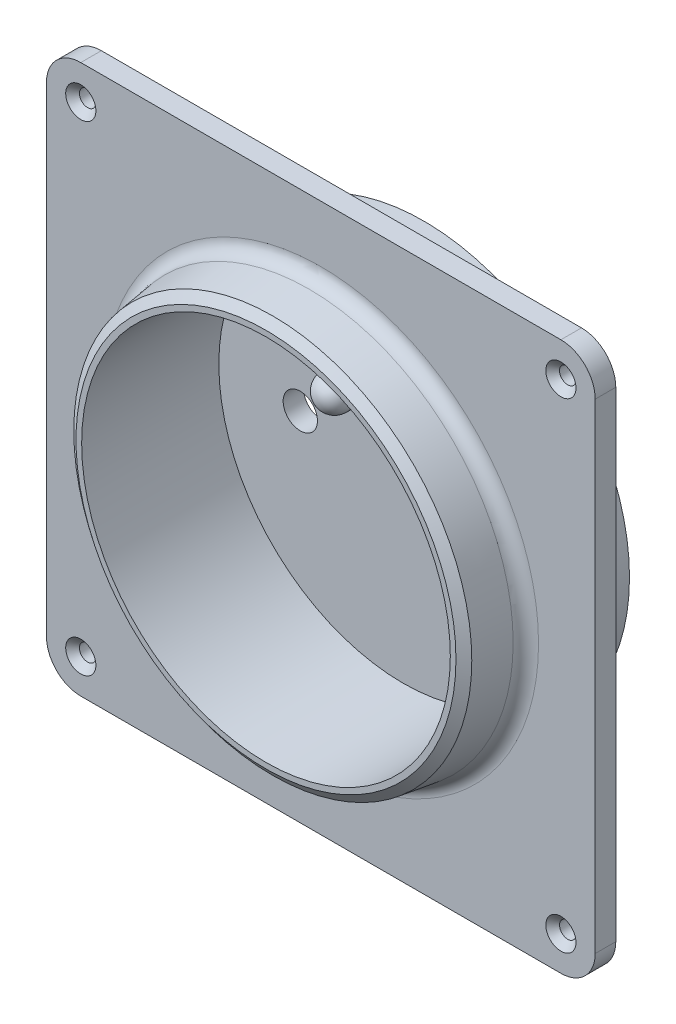
ISO-10303-21;
HEADER;
FILE_DESCRIPTION(('STEP AP214'),'2;1');
FILE_NAME('part.step','',(''),(''),'','','');
FILE_SCHEMA(('AUTOMOTIVE_DESIGN { 1 0 10303 214 1 1 1 1 }'));
ENDSEC;
DATA;
#1=APPLICATION_CONTEXT('core data for automotive mechanical design processes');
#2=APPLICATION_PROTOCOL_DEFINITION('international standard','automotive_design',2000,#1);
#3=PRODUCT_CONTEXT('',#1,'mechanical');
#4=PRODUCT('Part','Part','',(#3));
#5=PRODUCT_RELATED_PRODUCT_CATEGORY('part','',(#4));
#6=PRODUCT_DEFINITION_FORMATION('','',#4);
#7=PRODUCT_DEFINITION_CONTEXT('part definition',#1,'design');
#8=PRODUCT_DEFINITION('design','',#6,#7);
#9=PRODUCT_DEFINITION_SHAPE('','',#8);
#10=(LENGTH_UNIT() NAMED_UNIT(*) SI_UNIT(.MILLI.,.METRE.));
#11=(NAMED_UNIT(*) PLANE_ANGLE_UNIT() SI_UNIT($,.RADIAN.));
#12=(NAMED_UNIT(*) SI_UNIT($,.STERADIAN.) SOLID_ANGLE_UNIT());
#13=UNCERTAINTY_MEASURE_WITH_UNIT(LENGTH_MEASURE(1.E-05),#10,'distance_accuracy_value','');
#14=(GEOMETRIC_REPRESENTATION_CONTEXT(3) GLOBAL_UNCERTAINTY_ASSIGNED_CONTEXT((#13)) GLOBAL_UNIT_ASSIGNED_CONTEXT((#10,
#11,#12)) REPRESENTATION_CONTEXT('',''));
#15=CARTESIAN_POINT('',(0.,0.,0.));
#16=DIRECTION('',(0.,0.,1.));
#17=DIRECTION('',(1.,0.,0.));
#18=AXIS2_PLACEMENT_3D('',#15,#16,#17);
#19=CARTESIAN_POINT('',(40.,40.,1.5));
#20=DIRECTION('',(-1.,0.,0.));
#21=DIRECTION('',(0.,-1.,0.));
#22=AXIS2_PLACEMENT_3D('',#19,#20,#21);
#23=PLANE('',#22);
#24=DIRECTION('',(0.,1.,0.));
#25=VECTOR('',#24,1.);
#26=CARTESIAN_POINT('',(40.,40.,1.5));
#27=LINE('',#26,#25);
#28=CARTESIAN_POINT('',(40.,-35.,1.5));
#29=VERTEX_POINT('',#28);
#30=CARTESIAN_POINT('',(40.,35.,1.5));
#31=VERTEX_POINT('',#30);
#32=EDGE_CURVE('E132',#29,#31,#27,.T.);
#33=ORIENTED_EDGE('',*,*,#32,.F.);
#34=DIRECTION('',(0.,0.,-1.));
#35=VECTOR('',#34,1.);
#36=CARTESIAN_POINT('',(40.,-35.,1.5));
#37=LINE('',#36,#35);
#38=CARTESIAN_POINT('',(40.,-35.,-1.5));
#39=VERTEX_POINT('',#38);
#40=EDGE_CURVE('E116',#29,#39,#37,.T.);
#41=ORIENTED_EDGE('',*,*,#40,.T.);
#42=DIRECTION('',(0.,1.,0.));
#43=VECTOR('',#42,1.);
#44=CARTESIAN_POINT('',(40.,40.,-1.5));
#45=LINE('',#44,#43);
#46=CARTESIAN_POINT('',(40.,35.,-1.5));
#47=VERTEX_POINT('',#46);
#48=EDGE_CURVE('E129',#39,#47,#45,.T.);
#49=ORIENTED_EDGE('',*,*,#48,.T.);
#50=DIRECTION('',(0.,0.,-1.));
#51=VECTOR('',#50,1.);
#52=CARTESIAN_POINT('',(40.,35.,1.5));
#53=LINE('',#52,#51);
#54=EDGE_CURVE('E135',#47,#31,#53,.F.);
#55=ORIENTED_EDGE('',*,*,#54,.T.);
#56=EDGE_LOOP('',(#33,#41,#49,#55));
#57=FACE_BOUND('',#56,.T.);
#58=ADVANCED_FACE('F42',(#57),#23,.F.);
#59=CARTESIAN_POINT('',(-40.,40.,1.5));
#60=DIRECTION('',(0.,-1.,0.));
#61=DIRECTION('',(0.,0.,-1.));
#62=AXIS2_PLACEMENT_3D('',#59,#60,#61);
#63=PLANE('',#62);
#64=DIRECTION('',(-1.,0.,0.));
#65=VECTOR('',#64,1.);
#66=CARTESIAN_POINT('',(-40.,40.,-1.5));
#67=LINE('',#66,#65);
#68=CARTESIAN_POINT('',(35.,40.,-1.5));
#69=VERTEX_POINT('',#68);
#70=CARTESIAN_POINT('',(-35.,40.,-1.5));
#71=VERTEX_POINT('',#70);
#72=EDGE_CURVE('E140',#69,#71,#67,.T.);
#73=ORIENTED_EDGE('',*,*,#72,.T.);
#74=DIRECTION('',(0.,0.,-1.));
#75=VECTOR('',#74,1.);
#76=CARTESIAN_POINT('',(-35.,40.,1.5));
#77=LINE('',#76,#75);
#78=CARTESIAN_POINT('',(-35.,40.,1.5));
#79=VERTEX_POINT('',#78);
#80=EDGE_CURVE('E195',#71,#79,#77,.F.);
#81=ORIENTED_EDGE('',*,*,#80,.T.);
#82=DIRECTION('',(-1.,0.,0.));
#83=VECTOR('',#82,1.);
#84=CARTESIAN_POINT('',(-40.,40.,1.5));
#85=LINE('',#84,#83);
#86=CARTESIAN_POINT('',(35.,40.,1.5));
#87=VERTEX_POINT('',#86);
#88=EDGE_CURVE('E290',#87,#79,#85,.T.);
#89=ORIENTED_EDGE('',*,*,#88,.F.);
#90=DIRECTION('',(0.,0.,-1.));
#91=VECTOR('',#90,1.);
#92=CARTESIAN_POINT('',(35.,40.,1.5));
#93=LINE('',#92,#91);
#94=EDGE_CURVE('E191',#87,#69,#93,.T.);
#95=ORIENTED_EDGE('',*,*,#94,.T.);
#96=EDGE_LOOP('',(#73,#81,#89,#95));
#97=FACE_BOUND('',#96,.T.);
#98=ADVANCED_FACE('F311',(#97),#63,.F.);
#99=CARTESIAN_POINT('',(-40.,40.,1.5));
#100=DIRECTION('',(1.,0.,0.));
#101=DIRECTION('',(0.,1.,0.));
#102=AXIS2_PLACEMENT_3D('',#99,#100,#101);
#103=PLANE('',#102);
#104=DIRECTION('',(0.,-1.,0.));
#105=VECTOR('',#104,1.);
#106=CARTESIAN_POINT('',(-40.,40.,-1.5));
#107=LINE('',#106,#105);
#108=CARTESIAN_POINT('',(-40.,35.,-1.5));
#109=VERTEX_POINT('',#108);
#110=CARTESIAN_POINT('',(-40.,-35.,-1.5));
#111=VERTEX_POINT('',#110);
#112=EDGE_CURVE('E146',#109,#111,#107,.T.);
#113=ORIENTED_EDGE('',*,*,#112,.T.);
#114=DIRECTION('',(0.,0.,-1.));
#115=VECTOR('',#114,1.);
#116=CARTESIAN_POINT('',(-40.,-35.,1.5));
#117=LINE('',#116,#115);
#118=CARTESIAN_POINT('',(-40.,-35.,1.5));
#119=VERTEX_POINT('',#118);
#120=EDGE_CURVE('E60',#111,#119,#117,.F.);
#121=ORIENTED_EDGE('',*,*,#120,.T.);
#122=DIRECTION('',(0.,-1.,0.));
#123=VECTOR('',#122,1.);
#124=CARTESIAN_POINT('',(-40.,40.,1.5));
#125=LINE('',#124,#123);
#126=CARTESIAN_POINT('',(-40.,35.,1.5));
#127=VERTEX_POINT('',#126);
#128=EDGE_CURVE('E292',#127,#119,#125,.T.);
#129=ORIENTED_EDGE('',*,*,#128,.F.);
#130=DIRECTION('',(0.,0.,-1.));
#131=VECTOR('',#130,1.);
#132=CARTESIAN_POINT('',(-40.,35.,1.5));
#133=LINE('',#132,#131);
#134=EDGE_CURVE('E185',#127,#109,#133,.T.);
#135=ORIENTED_EDGE('',*,*,#134,.T.);
#136=EDGE_LOOP('',(#113,#121,#129,#135));
#137=FACE_BOUND('',#136,.T.);
#138=ADVANCED_FACE('F305',(#137),#103,.F.);
#139=CARTESIAN_POINT('',(-40.,-40.,1.5));
#140=DIRECTION('',(0.,1.,0.));
#141=DIRECTION('',(0.,0.,1.));
#142=AXIS2_PLACEMENT_3D('',#139,#140,#141);
#143=PLANE('',#142);
#144=DIRECTION('',(1.,0.,0.));
#145=VECTOR('',#144,1.);
#146=CARTESIAN_POINT('',(-40.,-40.,-1.5));
#147=LINE('',#146,#145);
#148=CARTESIAN_POINT('',(-35.,-40.,-1.5));
#149=VERTEX_POINT('',#148);
#150=CARTESIAN_POINT('',(35.,-40.,-1.5));
#151=VERTEX_POINT('',#150);
#152=EDGE_CURVE('E157',#149,#151,#147,.T.);
#153=ORIENTED_EDGE('',*,*,#152,.T.);
#154=DIRECTION('',(0.,0.,-1.));
#155=VECTOR('',#154,1.);
#156=CARTESIAN_POINT('',(35.,-40.,1.5));
#157=LINE('',#156,#155);
#158=CARTESIAN_POINT('',(35.,-40.,1.5));
#159=VERTEX_POINT('',#158);
#160=EDGE_CURVE('E117',#151,#159,#157,.F.);
#161=ORIENTED_EDGE('',*,*,#160,.T.);
#162=DIRECTION('',(1.,0.,0.));
#163=VECTOR('',#162,1.);
#164=CARTESIAN_POINT('',(-40.,-40.,1.5));
#165=LINE('',#164,#163);
#166=CARTESIAN_POINT('',(-35.,-40.,1.5));
#167=VERTEX_POINT('',#166);
#168=EDGE_CURVE('E152',#167,#159,#165,.T.);
#169=ORIENTED_EDGE('',*,*,#168,.F.);
#170=DIRECTION('',(0.,0.,-1.));
#171=VECTOR('',#170,1.);
#172=CARTESIAN_POINT('',(-35.,-40.,1.5));
#173=LINE('',#172,#171);
#174=EDGE_CURVE('E123',#167,#149,#173,.T.);
#175=ORIENTED_EDGE('',*,*,#174,.T.);
#176=EDGE_LOOP('',(#153,#161,#169,#175));
#177=FACE_BOUND('',#176,.T.);
#178=ADVANCED_FACE('F301',(#177),#143,.F.);
#179=CARTESIAN_POINT('',(0.,0.,1.5));
#180=DIRECTION('',(0.,0.,1.));
#181=DIRECTION('',(1.,0.,0.));
#182=AXIS2_PLACEMENT_3D('',#179,#180,#181);
#183=PLANE('',#182);
#184=CARTESIAN_POINT('',(-35.,35.,1.5));
#185=DIRECTION('',(0.,0.,1.));
#186=DIRECTION('',(1.,0.,0.));
#187=AXIS2_PLACEMENT_3D('',#184,#185,#186);
#188=CIRCLE('',#187,2.2);
#189=CARTESIAN_POINT('',(-32.8,35.,1.5));
#190=VERTEX_POINT('',#189);
#191=EDGE_CURVE('E611',#190,#190,#188,.T.);
#192=ORIENTED_EDGE('',*,*,#191,.F.);
#193=EDGE_LOOP('',(#192));
#194=FACE_BOUND('',#193,.T.);
#195=CARTESIAN_POINT('',(35.,35.,1.5));
#196=DIRECTION('',(0.,0.,1.));
#197=DIRECTION('',(1.,0.,0.));
#198=AXIS2_PLACEMENT_3D('',#195,#196,#197);
#199=CIRCLE('',#198,2.2);
#200=CARTESIAN_POINT('',(37.2,35.,1.5));
#201=VERTEX_POINT('',#200);
#202=EDGE_CURVE('E240',#201,#201,#199,.T.);
#203=ORIENTED_EDGE('',*,*,#202,.F.);
#204=EDGE_LOOP('',(#203));
#205=FACE_BOUND('',#204,.T.);
#206=CARTESIAN_POINT('',(-35.,-35.,1.5));
#207=DIRECTION('',(0.,0.,1.));
#208=DIRECTION('',(1.,0.,0.));
#209=AXIS2_PLACEMENT_3D('',#206,#207,#208);
#210=CIRCLE('',#209,2.2);
#211=CARTESIAN_POINT('',(-32.8,-35.,1.5));
#212=VERTEX_POINT('',#211);
#213=EDGE_CURVE('E231',#212,#212,#210,.T.);
#214=ORIENTED_EDGE('',*,*,#213,.F.);
#215=EDGE_LOOP('',(#214));
#216=FACE_BOUND('',#215,.T.);
#217=CARTESIAN_POINT('',(35.,-35.,1.5));
#218=DIRECTION('',(0.,0.,1.));
#219=DIRECTION('',(1.,0.,0.));
#220=AXIS2_PLACEMENT_3D('',#217,#218,#219);
#221=CIRCLE('',#220,2.2);
#222=CARTESIAN_POINT('',(37.2,-35.,1.5));
#223=VERTEX_POINT('',#222);
#224=EDGE_CURVE('E226',#223,#223,#221,.T.);
#225=ORIENTED_EDGE('',*,*,#224,.F.);
#226=EDGE_LOOP('',(#225));
#227=FACE_BOUND('',#226,.T.);
#228=CARTESIAN_POINT('',(0.,0.,1.5));
#229=DIRECTION('',(0.,0.,1.));
#230=DIRECTION('',(1.,0.,0.));
#231=AXIS2_PLACEMENT_3D('',#228,#229,#230);
#232=CIRCLE('',#231,31.7385734756324);
#233=CARTESIAN_POINT('',(31.7385734756324,0.,1.5));
#234=VERTEX_POINT('',#233);
#235=EDGE_CURVE('E12',#234,#234,#232,.F.);
#236=ORIENTED_EDGE('',*,*,#235,.T.);
#237=EDGE_LOOP('',(#236));
#238=FACE_BOUND('',#237,.T.);
#239=ORIENTED_EDGE('',*,*,#168,.T.);
#240=CARTESIAN_POINT('',(35.,-35.,1.5));
#241=DIRECTION('',(0.,0.,1.));
#242=DIRECTION('',(1.,0.,0.));
#243=AXIS2_PLACEMENT_3D('',#240,#241,#242);
#244=CIRCLE('',#243,5.);
#245=EDGE_CURVE('E182',#159,#29,#244,.T.);
#246=ORIENTED_EDGE('',*,*,#245,.T.);
#247=ORIENTED_EDGE('',*,*,#32,.T.);
#248=CARTESIAN_POINT('',(35.,35.,1.5));
#249=DIRECTION('',(0.,0.,1.));
#250=DIRECTION('',(1.,0.,0.));
#251=AXIS2_PLACEMENT_3D('',#248,#249,#250);
#252=CIRCLE('',#251,5.);
#253=EDGE_CURVE('E174',#31,#87,#252,.T.);
#254=ORIENTED_EDGE('',*,*,#253,.T.);
#255=ORIENTED_EDGE('',*,*,#88,.T.);
#256=CARTESIAN_POINT('',(-35.,35.,1.5));
#257=DIRECTION('',(0.,0.,1.));
#258=DIRECTION('',(1.,0.,0.));
#259=AXIS2_PLACEMENT_3D('',#256,#257,#258);
#260=CIRCLE('',#259,5.);
#261=EDGE_CURVE('E67',#79,#127,#260,.T.);
#262=ORIENTED_EDGE('',*,*,#261,.T.);
#263=ORIENTED_EDGE('',*,*,#128,.T.);
#264=CARTESIAN_POINT('',(-35.,-35.,1.5));
#265=DIRECTION('',(0.,0.,1.));
#266=DIRECTION('',(1.,0.,0.));
#267=AXIS2_PLACEMENT_3D('',#264,#265,#266);
#268=CIRCLE('',#267,5.);
#269=EDGE_CURVE('E179',#119,#167,#268,.T.);
#270=ORIENTED_EDGE('',*,*,#269,.T.);
#271=EDGE_LOOP('',(#239,#246,#247,#254,#255,#262,#263,#270));
#272=FACE_BOUND('',#271,.T.);
#273=ADVANCED_FACE('F298',(#194,#205,#216,#227,#238,#272),#183,.T.);
#274=CARTESIAN_POINT('',(0.,0.,-1.5));
#275=DIRECTION('',(0.,0.,1.));
#276=DIRECTION('',(1.,0.,0.));
#277=AXIS2_PLACEMENT_3D('',#274,#275,#276);
#278=PLANE('',#277);
#279=CARTESIAN_POINT('',(-35.,35.,-1.5));
#280=DIRECTION('',(0.,0.,1.));
#281=DIRECTION('',(1.,0.,0.));
#282=AXIS2_PLACEMENT_3D('',#279,#280,#281);
#283=CIRCLE('',#282,1.2);
#284=CARTESIAN_POINT('',(-33.8,35.,-1.5));
#285=VERTEX_POINT('',#284);
#286=EDGE_CURVE('E46',#285,#285,#283,.T.);
#287=ORIENTED_EDGE('',*,*,#286,.T.);
#288=EDGE_LOOP('',(#287));
#289=FACE_BOUND('',#288,.T.);
#290=CARTESIAN_POINT('',(35.,35.,-1.5));
#291=DIRECTION('',(0.,0.,1.));
#292=DIRECTION('',(1.,0.,0.));
#293=AXIS2_PLACEMENT_3D('',#290,#291,#292);
#294=CIRCLE('',#293,1.2);
#295=CARTESIAN_POINT('',(36.2,35.,-1.5));
#296=VERTEX_POINT('',#295);
#297=EDGE_CURVE('E228',#296,#296,#294,.T.);
#298=ORIENTED_EDGE('',*,*,#297,.T.);
#299=EDGE_LOOP('',(#298));
#300=FACE_BOUND('',#299,.T.);
#301=CARTESIAN_POINT('',(-35.,-35.,-1.5));
#302=DIRECTION('',(0.,0.,1.));
#303=DIRECTION('',(1.,0.,0.));
#304=AXIS2_PLACEMENT_3D('',#301,#302,#303);
#305=CIRCLE('',#304,1.2);
#306=CARTESIAN_POINT('',(-33.8,-35.,-1.5));
#307=VERTEX_POINT('',#306);
#308=EDGE_CURVE('E223',#307,#307,#305,.T.);
#309=ORIENTED_EDGE('',*,*,#308,.T.);
#310=EDGE_LOOP('',(#309));
#311=FACE_BOUND('',#310,.T.);
#312=CARTESIAN_POINT('',(35.,-35.,-1.5));
#313=DIRECTION('',(0.,0.,1.));
#314=DIRECTION('',(1.,0.,0.));
#315=AXIS2_PLACEMENT_3D('',#312,#313,#314);
#316=CIRCLE('',#315,1.2);
#317=CARTESIAN_POINT('',(36.2,-35.,-1.5));
#318=VERTEX_POINT('',#317);
#319=EDGE_CURVE('E217',#318,#318,#316,.T.);
#320=ORIENTED_EDGE('',*,*,#319,.T.);
#321=EDGE_LOOP('',(#320));
#322=FACE_BOUND('',#321,.T.);
#323=CARTESIAN_POINT('',(0.,0.,-1.5));
#324=DIRECTION('',(0.,0.,1.));
#325=DIRECTION('',(1.,0.,0.));
#326=AXIS2_PLACEMENT_3D('',#323,#324,#325);
#327=CIRCLE('',#326,32.);
#328=CARTESIAN_POINT('',(32.,0.,-1.5));
#329=VERTEX_POINT('',#328);
#330=EDGE_CURVE('E206',#329,#329,#327,.T.);
#331=ORIENTED_EDGE('',*,*,#330,.T.);
#332=EDGE_LOOP('',(#331));
#333=FACE_BOUND('',#332,.T.);
#334=ORIENTED_EDGE('',*,*,#48,.F.);
#335=CARTESIAN_POINT('',(35.,-35.,-1.5));
#336=DIRECTION('',(0.,0.,1.));
#337=DIRECTION('',(1.,0.,0.));
#338=AXIS2_PLACEMENT_3D('',#335,#336,#337);
#339=CIRCLE('',#338,5.);
#340=EDGE_CURVE('E112',#39,#151,#339,.F.);
#341=ORIENTED_EDGE('',*,*,#340,.T.);
#342=ORIENTED_EDGE('',*,*,#152,.F.);
#343=CARTESIAN_POINT('',(-35.,-35.,-1.5));
#344=DIRECTION('',(0.,0.,1.));
#345=DIRECTION('',(1.,0.,0.));
#346=AXIS2_PLACEMENT_3D('',#343,#344,#345);
#347=CIRCLE('',#346,5.);
#348=EDGE_CURVE('E124',#149,#111,#347,.F.);
#349=ORIENTED_EDGE('',*,*,#348,.T.);
#350=ORIENTED_EDGE('',*,*,#112,.F.);
#351=CARTESIAN_POINT('',(-35.,35.,-1.5));
#352=DIRECTION('',(0.,0.,1.));
#353=DIRECTION('',(1.,0.,0.));
#354=AXIS2_PLACEMENT_3D('',#351,#352,#353);
#355=CIRCLE('',#354,5.);
#356=EDGE_CURVE('E164',#109,#71,#355,.F.);
#357=ORIENTED_EDGE('',*,*,#356,.T.);
#358=ORIENTED_EDGE('',*,*,#72,.F.);
#359=CARTESIAN_POINT('',(35.,35.,-1.5));
#360=DIRECTION('',(0.,0.,1.));
#361=DIRECTION('',(1.,0.,0.));
#362=AXIS2_PLACEMENT_3D('',#359,#360,#361);
#363=CIRCLE('',#362,5.);
#364=EDGE_CURVE('E134',#69,#47,#363,.F.);
#365=ORIENTED_EDGE('',*,*,#364,.T.);
#366=EDGE_LOOP('',(#334,#341,#342,#349,#350,#357,#358,#365));
#367=FACE_BOUND('',#366,.T.);
#368=ADVANCED_FACE('F137',(#289,#300,#311,#322,#333,#367),#278,.F.);
#369=CARTESIAN_POINT('',(35.,-35.,1.5));
#370=DIRECTION('',(0.,0.,-1.));
#371=DIRECTION('',(-1.,0.,0.));
#372=AXIS2_PLACEMENT_3D('',#369,#370,#371);
#373=CYLINDRICAL_SURFACE('',#372,5.);
#374=ORIENTED_EDGE('',*,*,#245,.F.);
#375=ORIENTED_EDGE('',*,*,#160,.F.);
#376=ORIENTED_EDGE('',*,*,#340,.F.);
#377=ORIENTED_EDGE('',*,*,#40,.F.);
#378=EDGE_LOOP('',(#374,#375,#376,#377));
#379=FACE_BOUND('',#378,.T.);
#380=ADVANCED_FACE('F115',(#379),#373,.T.);
#381=CARTESIAN_POINT('',(-35.,-35.,1.5));
#382=DIRECTION('',(0.,0.,-1.));
#383=DIRECTION('',(-1.,0.,0.));
#384=AXIS2_PLACEMENT_3D('',#381,#382,#383);
#385=CYLINDRICAL_SURFACE('',#384,5.);
#386=ORIENTED_EDGE('',*,*,#269,.F.);
#387=ORIENTED_EDGE('',*,*,#120,.F.);
#388=ORIENTED_EDGE('',*,*,#348,.F.);
#389=ORIENTED_EDGE('',*,*,#174,.F.);
#390=EDGE_LOOP('',(#386,#387,#388,#389));
#391=FACE_BOUND('',#390,.T.);
#392=ADVANCED_FACE('F303',(#391),#385,.T.);
#393=CARTESIAN_POINT('',(-35.,35.,1.5));
#394=DIRECTION('',(0.,0.,-1.));
#395=DIRECTION('',(-1.,0.,0.));
#396=AXIS2_PLACEMENT_3D('',#393,#394,#395);
#397=CYLINDRICAL_SURFACE('',#396,5.);
#398=ORIENTED_EDGE('',*,*,#261,.F.);
#399=ORIENTED_EDGE('',*,*,#80,.F.);
#400=ORIENTED_EDGE('',*,*,#356,.F.);
#401=ORIENTED_EDGE('',*,*,#134,.F.);
#402=EDGE_LOOP('',(#398,#399,#400,#401));
#403=FACE_BOUND('',#402,.T.);
#404=ADVANCED_FACE('F308',(#403),#397,.T.);
#405=CARTESIAN_POINT('',(35.,35.,1.5));
#406=DIRECTION('',(0.,0.,-1.));
#407=DIRECTION('',(-1.,0.,0.));
#408=AXIS2_PLACEMENT_3D('',#405,#406,#407);
#409=CYLINDRICAL_SURFACE('',#408,5.);
#410=ORIENTED_EDGE('',*,*,#253,.F.);
#411=ORIENTED_EDGE('',*,*,#54,.F.);
#412=ORIENTED_EDGE('',*,*,#364,.F.);
#413=ORIENTED_EDGE('',*,*,#94,.F.);
#414=EDGE_LOOP('',(#410,#411,#412,#413));
#415=FACE_BOUND('',#414,.T.);
#416=ADVANCED_FACE('F316',(#415),#409,.T.);
#417=CARTESIAN_POINT('',(0.,0.,-13.5));
#418=DIRECTION('',(0.,0.,1.));
#419=DIRECTION('',(1.,0.,0.));
#420=AXIS2_PLACEMENT_3D('',#417,#418,#419);
#421=PLANE('',#420);
#422=CARTESIAN_POINT('',(-15.,0.,-13.5));
#423=DIRECTION('',(0.,0.,1.));
#424=DIRECTION('',(1.,0.,0.));
#425=AXIS2_PLACEMENT_3D('',#422,#423,#424);
#426=CIRCLE('',#425,2.5);
#427=CARTESIAN_POINT('',(-12.5,0.,-13.5));
#428=VERTEX_POINT('',#427);
#429=EDGE_CURVE('E269',#428,#428,#426,.T.);
#430=ORIENTED_EDGE('',*,*,#429,.T.);
#431=EDGE_LOOP('',(#430));
#432=FACE_BOUND('',#431,.T.);
#433=CARTESIAN_POINT('',(15.,0.,-13.5));
#434=DIRECTION('',(0.,0.,1.));
#435=DIRECTION('',(1.,0.,0.));
#436=AXIS2_PLACEMENT_3D('',#433,#434,#435);
#437=CIRCLE('',#436,2.5);
#438=CARTESIAN_POINT('',(17.5,0.,-13.5));
#439=VERTEX_POINT('',#438);
#440=EDGE_CURVE('E277',#439,#439,#437,.T.);
#441=ORIENTED_EDGE('',*,*,#440,.T.);
#442=EDGE_LOOP('',(#441));
#443=FACE_BOUND('',#442,.T.);
#444=CARTESIAN_POINT('',(0.,0.,-13.5));
#445=DIRECTION('',(0.,0.,1.));
#446=DIRECTION('',(1.,0.,0.));
#447=AXIS2_PLACEMENT_3D('',#444,#445,#446);
#448=CIRCLE('',#447,30.);
#449=CARTESIAN_POINT('',(30.,0.,-13.5));
#450=VERTEX_POINT('',#449);
#451=EDGE_CURVE('E141',#450,#450,#448,.T.);
#452=ORIENTED_EDGE('',*,*,#451,.F.);
#453=EDGE_LOOP('',(#452));
#454=FACE_BOUND('',#453,.T.);
#455=ADVANCED_FACE('F318',(#432,#443,#454),#421,.F.);
#456=CARTESIAN_POINT('',(0.,0.,-13.5));
#457=DIRECTION('',(0.,0.,1.));
#458=DIRECTION('',(1.,0.,0.));
#459=AXIS2_PLACEMENT_3D('',#456,#457,#458);
#460=CYLINDRICAL_SURFACE('',#459,30.);
#461=CARTESIAN_POINT('',(0.,0.,-3.5));
#462=DIRECTION('',(0.,0.,1.));
#463=DIRECTION('',(1.,0.,0.));
#464=AXIS2_PLACEMENT_3D('',#461,#462,#463);
#465=CIRCLE('',#464,30.);
#466=CARTESIAN_POINT('',(30.,0.,-3.5));
#467=VERTEX_POINT('',#466);
#468=EDGE_CURVE('E210',#467,#467,#465,.F.);
#469=ORIENTED_EDGE('',*,*,#468,.T.);
#470=EDGE_LOOP('',(#469));
#471=FACE_BOUND('',#470,.T.);
#472=ORIENTED_EDGE('',*,*,#451,.T.);
#473=EDGE_LOOP('',(#472));
#474=FACE_BOUND('',#473,.T.);
#475=ADVANCED_FACE('F324',(#471,#474),#460,.T.);
#476=CARTESIAN_POINT('',(0.,0.,1.5));
#477=DIRECTION('',(0.,0.,-1.));
#478=DIRECTION('',(1.,0.,0.));
#479=AXIS2_PLACEMENT_3D('',#476,#477,#478);
#480=CONICAL_SURFACE('',#479,30.,0.139626340159547);
#481=CARTESIAN_POINT('',(0.,0.,3.22165379807987));
#482=DIRECTION('',(0.,0.,1.));
#483=DIRECTION('',(1.,0.,0.));
#484=AXIS2_PLACEMENT_3D('',#481,#482,#483);
#485=CIRCLE('',#484,29.7580373381493);
#486=CARTESIAN_POINT('',(29.7580373381493,0.,3.22165379807987));
#487=VERTEX_POINT('',#486);
#488=EDGE_CURVE('E52',#487,#487,#485,.T.);
#489=ORIENTED_EDGE('',*,*,#488,.T.);
#490=EDGE_LOOP('',(#489));
#491=FACE_BOUND('',#490,.T.);
#492=CARTESIAN_POINT('',(0.,0.,8.50973193125844));
#493=DIRECTION('',(0.,0.,-1.));
#494=DIRECTION('',(-1.,0.,0.));
#495=AXIS2_PLACEMENT_3D('',#492,#493,#494);
#496=CIRCLE('',#495,29.0148464233409);
#497=CARTESIAN_POINT('',(-29.0148464233409,0.,8.50973193125844));
#498=VERTEX_POINT('',#497);
#499=EDGE_CURVE('E202',#498,#498,#496,.T.);
#500=ORIENTED_EDGE('',*,*,#499,.T.);
#501=EDGE_LOOP('',(#500));
#502=FACE_BOUND('',#501,.T.);
#503=ADVANCED_FACE('F434',(#491,#502),#480,.T.);
#504=CARTESIAN_POINT('',(0.,0.,9.5));
#505=DIRECTION('',(0.,0.,1.));
#506=DIRECTION('',(1.,0.,0.));
#507=AXIS2_PLACEMENT_3D('',#504,#505,#506);
#508=PLANE('',#507);
#509=CARTESIAN_POINT('',(0.,0.,9.5));
#510=DIRECTION('',(0.,0.,1.));
#511=DIRECTION('',(1.,0.,0.));
#512=AXIS2_PLACEMENT_3D('',#509,#510,#511);
#513=CIRCLE('',#512,27.7007163107014);
#514=CARTESIAN_POINT('',(27.7007163107014,0.,9.5));
#515=VERTEX_POINT('',#514);
#516=EDGE_CURVE('E198',#515,#515,#513,.T.);
#517=ORIENTED_EDGE('',*,*,#516,.T.);
#518=EDGE_LOOP('',(#517));
#519=FACE_BOUND('',#518,.T.);
#520=CARTESIAN_POINT('',(0.,0.,9.5));
#521=DIRECTION('',(0.,0.,1.));
#522=DIRECTION('',(1.,0.,0.));
#523=AXIS2_PLACEMENT_3D('',#520,#521,#522);
#524=CIRCLE('',#523,26.8756733223809);
#525=CARTESIAN_POINT('',(26.8756733223809,0.,9.5));
#526=VERTEX_POINT('',#525);
#527=EDGE_CURVE('E281',#526,#526,#524,.T.);
#528=ORIENTED_EDGE('',*,*,#527,.F.);
#529=EDGE_LOOP('',(#528));
#530=FACE_BOUND('',#529,.T.);
#531=ADVANCED_FACE('F365',(#519,#530),#508,.T.);
#532=CARTESIAN_POINT('',(0.,0.,-89.5158834208396));
#533=DIRECTION('',(0.,0.,1.));
#534=DIRECTION('',(1.,0.,0.));
#535=AXIS2_PLACEMENT_3D('',#532,#533,#534);
#536=CYLINDRICAL_SURFACE('',#535,26.8756733223809);
#537=CARTESIAN_POINT('',(0.,0.,-10.5));
#538=DIRECTION('',(0.,0.,1.));
#539=DIRECTION('',(1.,0.,0.));
#540=AXIS2_PLACEMENT_3D('',#537,#538,#539);
#541=CIRCLE('',#540,26.8756733223809);
#542=CARTESIAN_POINT('',(26.8756733223809,0.,-10.5));
#543=VERTEX_POINT('',#542);
#544=EDGE_CURVE('E149',#543,#543,#541,.F.);
#545=ORIENTED_EDGE('',*,*,#544,.T.);
#546=EDGE_LOOP('',(#545));
#547=FACE_BOUND('',#546,.T.);
#548=ORIENTED_EDGE('',*,*,#527,.T.);
#549=EDGE_LOOP('',(#548));
#550=FACE_BOUND('',#549,.T.);
#551=ADVANCED_FACE('F359',(#547,#550),#536,.F.);
#552=CARTESIAN_POINT('',(0.,0.,-10.5));
#553=DIRECTION('',(0.,0.,1.));
#554=DIRECTION('',(1.,0.,0.));
#555=AXIS2_PLACEMENT_3D('',#552,#553,#554);
#556=PLANE('',#555);
#557=CARTESIAN_POINT('',(0.,15.,-10.5));
#558=DIRECTION('',(0.,0.,1.));
#559=DIRECTION('',(1.,0.,0.));
#560=AXIS2_PLACEMENT_3D('',#557,#558,#559);
#561=CIRCLE('',#560,2.5);
#562=CARTESIAN_POINT('',(2.5,15.,-10.5));
#563=VERTEX_POINT('',#562);
#564=EDGE_CURVE('E221',#563,#563,#561,.T.);
#565=ORIENTED_EDGE('',*,*,#564,.F.);
#566=EDGE_LOOP('',(#565));
#567=FACE_BOUND('',#566,.T.);
#568=CARTESIAN_POINT('',(-15.,0.,-10.5));
#569=DIRECTION('',(0.,0.,1.));
#570=DIRECTION('',(1.,0.,0.));
#571=AXIS2_PLACEMENT_3D('',#568,#569,#570);
#572=CIRCLE('',#571,2.5);
#573=CARTESIAN_POINT('',(-12.5,0.,-10.5));
#574=VERTEX_POINT('',#573);
#575=EDGE_CURVE('E262',#574,#574,#572,.T.);
#576=ORIENTED_EDGE('',*,*,#575,.F.);
#577=EDGE_LOOP('',(#576));
#578=FACE_BOUND('',#577,.T.);
#579=CARTESIAN_POINT('',(15.,0.,-10.5));
#580=DIRECTION('',(0.,0.,1.));
#581=DIRECTION('',(1.,0.,0.));
#582=AXIS2_PLACEMENT_3D('',#579,#580,#581);
#583=CIRCLE('',#582,2.5);
#584=CARTESIAN_POINT('',(17.5,0.,-10.5));
#585=VERTEX_POINT('',#584);
#586=EDGE_CURVE('E273',#585,#585,#583,.T.);
#587=ORIENTED_EDGE('',*,*,#586,.F.);
#588=EDGE_LOOP('',(#587));
#589=FACE_BOUND('',#588,.T.);
#590=ORIENTED_EDGE('',*,*,#544,.F.);
#591=EDGE_LOOP('',(#590));
#592=FACE_BOUND('',#591,.T.);
#593=ADVANCED_FACE('F364',(#567,#578,#589,#592),#556,.T.);
#594=CARTESIAN_POINT('',(15.,0.,-10.5));
#595=DIRECTION('',(0.,0.,1.));
#596=DIRECTION('',(1.,0.,0.));
#597=AXIS2_PLACEMENT_3D('',#594,#595,#596);
#598=CYLINDRICAL_SURFACE('',#597,2.5);
#599=ORIENTED_EDGE('',*,*,#440,.F.);
#600=EDGE_LOOP('',(#599));
#601=FACE_BOUND('',#600,.T.);
#602=ORIENTED_EDGE('',*,*,#586,.T.);
#603=EDGE_LOOP('',(#602));
#604=FACE_BOUND('',#603,.T.);
#605=ADVANCED_FACE('F382',(#601,#604),#598,.F.);
#606=CARTESIAN_POINT('',(-15.,0.,-10.5));
#607=DIRECTION('',(0.,0.,1.));
#608=DIRECTION('',(1.,0.,0.));
#609=AXIS2_PLACEMENT_3D('',#606,#607,#608);
#610=CYLINDRICAL_SURFACE('',#609,2.5);
#611=ORIENTED_EDGE('',*,*,#429,.F.);
#612=EDGE_LOOP('',(#611));
#613=FACE_BOUND('',#612,.T.);
#614=ORIENTED_EDGE('',*,*,#575,.T.);
#615=EDGE_LOOP('',(#614));
#616=FACE_BOUND('',#615,.T.);
#617=ADVANCED_FACE('F387',(#613,#616),#610,.F.);
#618=CARTESIAN_POINT('',(0.,15.,-0.499999999999999));
#619=DIRECTION('',(0.,0.,-1.));
#620=DIRECTION('',(-1.,0.,0.));
#621=AXIS2_PLACEMENT_3D('',#618,#619,#620);
#622=CYLINDRICAL_SURFACE('',#621,2.5);
#623=CARTESIAN_POINT('',(0.,15.,-0.499999999999999));
#624=DIRECTION('',(0.,0.,1.));
#625=DIRECTION('',(1.,0.,0.));
#626=AXIS2_PLACEMENT_3D('',#623,#624,#625);
#627=CIRCLE('',#626,2.5);
#628=CARTESIAN_POINT('',(2.5,15.,-0.499999999999999));
#629=VERTEX_POINT('',#628);
#630=EDGE_CURVE('E258',#629,#629,#627,.T.);
#631=ORIENTED_EDGE('',*,*,#630,.F.);
#632=EDGE_LOOP('',(#631));
#633=FACE_BOUND('',#632,.T.);
#634=ORIENTED_EDGE('',*,*,#564,.T.);
#635=EDGE_LOOP('',(#634));
#636=FACE_BOUND('',#635,.T.);
#637=ADVANCED_FACE('F397',(#633,#636),#622,.T.);
#638=CARTESIAN_POINT('',(0.,15.,-0.499999999999999));
#639=DIRECTION('',(0.,1.,0.));
#640=DIRECTION('',(-1.,0.,0.));
#641=AXIS2_PLACEMENT_3D('',#638,#639,#640);
#642=SPHERICAL_SURFACE('',#641,2.5);
#643=CARTESIAN_POINT('',(0.,15.,-0.499999999999999));
#644=DIRECTION('',(0.,0.,1.));
#645=DIRECTION('',(1.,0.,0.));
#646=AXIS2_PLACEMENT_3D('',#643,#644,#645);
#647=SPHERICAL_SURFACE('',#646,2.5);
#648=ORIENTED_EDGE('',*,*,#630,.T.);
#649=EDGE_LOOP('',(#648));
#650=FACE_BOUND('',#649,.T.);
#651=ADVANCED_FACE('F414',(#650),#647,.T.);
#652=CARTESIAN_POINT('',(0.,0.,9.5));
#653=DIRECTION('',(0.,0.,-1.));
#654=DIRECTION('',(-1.,0.,0.));
#655=AXIS2_PLACEMENT_3D('',#652,#653,#654);
#656=CONICAL_SURFACE('',#655,27.7007163107014,0.925024503556996);
#657=ORIENTED_EDGE('',*,*,#499,.F.);
#658=EDGE_LOOP('',(#657));
#659=FACE_BOUND('',#658,.T.);
#660=ORIENTED_EDGE('',*,*,#516,.F.);
#661=EDGE_LOOP('',(#660));
#662=FACE_BOUND('',#661,.T.);
#663=ADVANCED_FACE('F424',(#659,#662),#656,.T.);
#664=CARTESIAN_POINT('',(0.,0.,-3.5));
#665=DIRECTION('',(0.,0.,1.));
#666=DIRECTION('',(1.,0.,0.));
#667=AXIS2_PLACEMENT_3D('',#664,#665,#666);
#668=TOROIDAL_SURFACE('',#667,32.,2.);
#669=ORIENTED_EDGE('',*,*,#468,.F.);
#670=EDGE_LOOP('',(#669));
#671=FACE_BOUND('',#670,.T.);
#672=ORIENTED_EDGE('',*,*,#330,.F.);
#673=EDGE_LOOP('',(#672));
#674=FACE_BOUND('',#673,.T.);
#675=ADVANCED_FACE('F444',(#671,#674),#668,.F.);
#676=CARTESIAN_POINT('',(0.,0.,3.5));
#677=DIRECTION('',(0.,0.,1.));
#678=DIRECTION('',(1.,0.,0.));
#679=AXIS2_PLACEMENT_3D('',#676,#677,#678);
#680=TOROIDAL_SURFACE('',#679,31.7385734756324,2.);
#681=ORIENTED_EDGE('',*,*,#235,.F.);
#682=EDGE_LOOP('',(#681));
#683=FACE_BOUND('',#682,.T.);
#684=ORIENTED_EDGE('',*,*,#488,.F.);
#685=EDGE_LOOP('',(#684));
#686=FACE_BOUND('',#685,.T.);
#687=ADVANCED_FACE('F44',(#683,#686),#680,.F.);
#688=CARTESIAN_POINT('',(35.,-35.,1.5));
#689=DIRECTION('',(0.,0.,1.));
#690=DIRECTION('',(1.,0.,0.));
#691=AXIS2_PLACEMENT_3D('',#688,#689,#690);
#692=CYLINDRICAL_SURFACE('',#691,1.2);
#693=CARTESIAN_POINT('',(35.,-35.,0.499999999999997));
#694=DIRECTION('',(0.,0.,1.));
#695=DIRECTION('',(1.,0.,0.));
#696=AXIS2_PLACEMENT_3D('',#693,#694,#695);
#697=CIRCLE('',#696,1.2);
#698=CARTESIAN_POINT('',(36.2,-35.,0.499999999999997));
#699=VERTEX_POINT('',#698);
#700=EDGE_CURVE('E222',#699,#699,#697,.T.);
#701=ORIENTED_EDGE('',*,*,#700,.T.);
#702=EDGE_LOOP('',(#701));
#703=FACE_BOUND('',#702,.T.);
#704=ORIENTED_EDGE('',*,*,#319,.F.);
#705=EDGE_LOOP('',(#704));
#706=FACE_BOUND('',#705,.T.);
#707=ADVANCED_FACE('F475',(#703,#706),#692,.F.);
#708=CARTESIAN_POINT('',(35.,-35.,1.5));
#709=DIRECTION('',(0.,0.,1.));
#710=DIRECTION('',(1.,0.,0.));
#711=AXIS2_PLACEMENT_3D('',#708,#709,#710);
#712=CONICAL_SURFACE('',#711,2.2,0.785398163397447);
#713=ORIENTED_EDGE('',*,*,#700,.F.);
#714=EDGE_LOOP('',(#713));
#715=FACE_BOUND('',#714,.T.);
#716=ORIENTED_EDGE('',*,*,#224,.T.);
#717=EDGE_LOOP('',(#716));
#718=FACE_BOUND('',#717,.T.);
#719=ADVANCED_FACE('F504',(#715,#718),#712,.F.);
#720=CARTESIAN_POINT('',(-35.,-35.,1.5));
#721=DIRECTION('',(0.,0.,1.));
#722=DIRECTION('',(1.,0.,0.));
#723=AXIS2_PLACEMENT_3D('',#720,#721,#722);
#724=CYLINDRICAL_SURFACE('',#723,1.2);
#725=CARTESIAN_POINT('',(-35.,-35.,0.499999999999997));
#726=DIRECTION('',(0.,0.,1.));
#727=DIRECTION('',(1.,0.,0.));
#728=AXIS2_PLACEMENT_3D('',#725,#726,#727);
#729=CIRCLE('',#728,1.2);
#730=CARTESIAN_POINT('',(-33.8,-35.,0.499999999999997));
#731=VERTEX_POINT('',#730);
#732=EDGE_CURVE('E227',#731,#731,#729,.T.);
#733=ORIENTED_EDGE('',*,*,#732,.T.);
#734=EDGE_LOOP('',(#733));
#735=FACE_BOUND('',#734,.T.);
#736=ORIENTED_EDGE('',*,*,#308,.F.);
#737=EDGE_LOOP('',(#736));
#738=FACE_BOUND('',#737,.T.);
#739=ADVANCED_FACE('F514',(#735,#738),#724,.F.);
#740=CARTESIAN_POINT('',(-35.,-35.,1.5));
#741=DIRECTION('',(0.,0.,1.));
#742=DIRECTION('',(1.,0.,0.));
#743=AXIS2_PLACEMENT_3D('',#740,#741,#742);
#744=CONICAL_SURFACE('',#743,2.2,0.785398163397447);
#745=ORIENTED_EDGE('',*,*,#732,.F.);
#746=EDGE_LOOP('',(#745));
#747=FACE_BOUND('',#746,.T.);
#748=ORIENTED_EDGE('',*,*,#213,.T.);
#749=EDGE_LOOP('',(#748));
#750=FACE_BOUND('',#749,.T.);
#751=ADVANCED_FACE('F524',(#747,#750),#744,.F.);
#752=CARTESIAN_POINT('',(35.,35.,1.5));
#753=DIRECTION('',(0.,0.,1.));
#754=DIRECTION('',(1.,0.,0.));
#755=AXIS2_PLACEMENT_3D('',#752,#753,#754);
#756=CYLINDRICAL_SURFACE('',#755,1.2);
#757=CARTESIAN_POINT('',(35.,35.,0.499999999999997));
#758=DIRECTION('',(0.,0.,1.));
#759=DIRECTION('',(1.,0.,0.));
#760=AXIS2_PLACEMENT_3D('',#757,#758,#759);
#761=CIRCLE('',#760,1.2);
#762=CARTESIAN_POINT('',(36.2,35.,0.499999999999997));
#763=VERTEX_POINT('',#762);
#764=EDGE_CURVE('E232',#763,#763,#761,.T.);
#765=ORIENTED_EDGE('',*,*,#764,.T.);
#766=EDGE_LOOP('',(#765));
#767=FACE_BOUND('',#766,.T.);
#768=ORIENTED_EDGE('',*,*,#297,.F.);
#769=EDGE_LOOP('',(#768));
#770=FACE_BOUND('',#769,.T.);
#771=ADVANCED_FACE('F534',(#767,#770),#756,.F.);
#772=CARTESIAN_POINT('',(35.,35.,1.5));
#773=DIRECTION('',(0.,0.,1.));
#774=DIRECTION('',(1.,0.,0.));
#775=AXIS2_PLACEMENT_3D('',#772,#773,#774);
#776=CONICAL_SURFACE('',#775,2.2,0.785398163397447);
#777=ORIENTED_EDGE('',*,*,#764,.F.);
#778=EDGE_LOOP('',(#777));
#779=FACE_BOUND('',#778,.T.);
#780=ORIENTED_EDGE('',*,*,#202,.T.);
#781=EDGE_LOOP('',(#780));
#782=FACE_BOUND('',#781,.T.);
#783=ADVANCED_FACE('F544',(#779,#782),#776,.F.);
#784=CARTESIAN_POINT('',(-35.,35.,1.5));
#785=DIRECTION('',(0.,0.,1.));
#786=DIRECTION('',(1.,0.,0.));
#787=AXIS2_PLACEMENT_3D('',#784,#785,#786);
#788=CYLINDRICAL_SURFACE('',#787,1.2);
#789=CARTESIAN_POINT('',(-35.,35.,0.499999999999997));
#790=DIRECTION('',(0.,0.,1.));
#791=DIRECTION('',(1.,0.,0.));
#792=AXIS2_PLACEMENT_3D('',#789,#790,#791);
#793=CIRCLE('',#792,1.2);
#794=CARTESIAN_POINT('',(-33.8,35.,0.499999999999997));
#795=VERTEX_POINT('',#794);
#796=EDGE_CURVE('E608',#795,#795,#793,.T.);
#797=ORIENTED_EDGE('',*,*,#796,.T.);
#798=EDGE_LOOP('',(#797));
#799=FACE_BOUND('',#798,.T.);
#800=ORIENTED_EDGE('',*,*,#286,.F.);
#801=EDGE_LOOP('',(#800));
#802=FACE_BOUND('',#801,.T.);
#803=ADVANCED_FACE('F553',(#799,#802),#788,.F.);
#804=CARTESIAN_POINT('',(-35.,35.,1.5));
#805=DIRECTION('',(0.,0.,1.));
#806=DIRECTION('',(1.,0.,0.));
#807=AXIS2_PLACEMENT_3D('',#804,#805,#806);
#808=CONICAL_SURFACE('',#807,2.2,0.785398163397447);
#809=ORIENTED_EDGE('',*,*,#796,.F.);
#810=EDGE_LOOP('',(#809));
#811=FACE_BOUND('',#810,.T.);
#812=ORIENTED_EDGE('',*,*,#191,.T.);
#813=EDGE_LOOP('',(#812));
#814=FACE_BOUND('',#813,.T.);
#815=ADVANCED_FACE('F563',(#811,#814),#808,.F.);
#816=CLOSED_SHELL('',(#58,#98,#138,#178,#273,#368,#380,#392,#404,#416,#455,#475,#503,#531,#551,
#593,#605,#617,#637,#651,#663,#675,#687,#707,#719,#739,#751,#771,#783,#803,#815));
#817=MANIFOLD_SOLID_BREP('B2',#816);
#818=ADVANCED_BREP_SHAPE_REPRESENTATION('',(#18,#817),#14);
#819=SHAPE_DEFINITION_REPRESENTATION(#9,#818);
ENDSEC;
END-ISO-10303-21;
